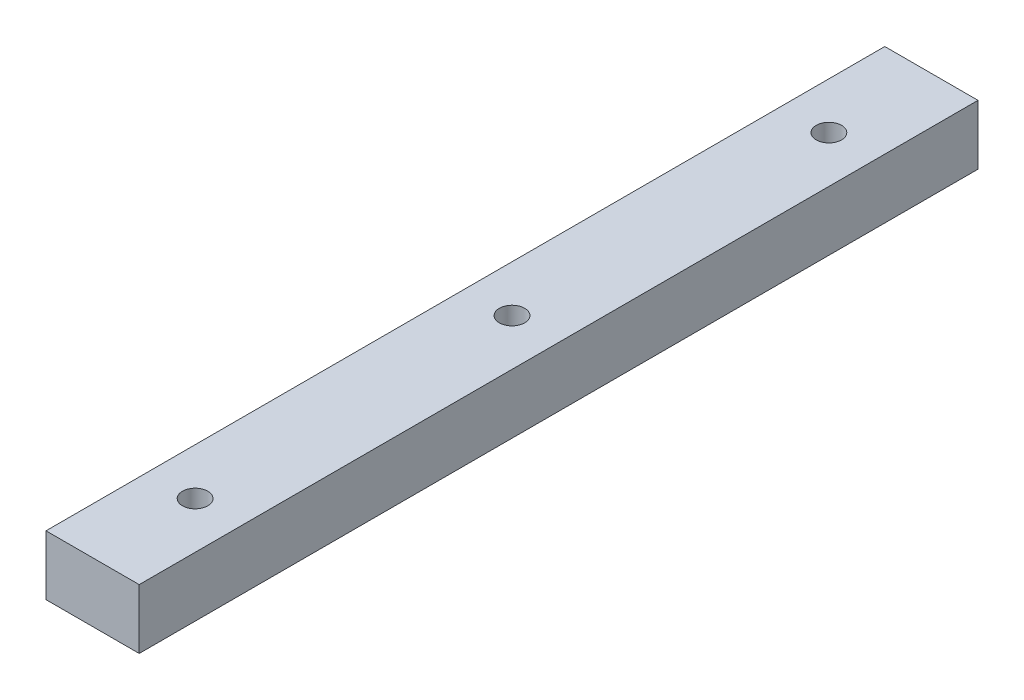
ISO-10303-21;
HEADER;
FILE_DESCRIPTION(('STEP AP214'),'2;1');
FILE_NAME('part.step','',(''),(''),'','','');
FILE_SCHEMA(('AUTOMOTIVE_DESIGN { 1 0 10303 214 1 1 1 1 }'));
ENDSEC;
DATA;
#1=APPLICATION_CONTEXT('core data for automotive mechanical design processes');
#2=APPLICATION_PROTOCOL_DEFINITION('international standard','automotive_design',2000,#1);
#3=PRODUCT_CONTEXT('',#1,'mechanical');
#4=PRODUCT('Part','Part','',(#3));
#5=PRODUCT_RELATED_PRODUCT_CATEGORY('part','',(#4));
#6=PRODUCT_DEFINITION_FORMATION('','',#4);
#7=PRODUCT_DEFINITION_CONTEXT('part definition',#1,'design');
#8=PRODUCT_DEFINITION('design','',#6,#7);
#9=PRODUCT_DEFINITION_SHAPE('','',#8);
#10=(LENGTH_UNIT() NAMED_UNIT(*) SI_UNIT(.MILLI.,.METRE.));
#11=(NAMED_UNIT(*) PLANE_ANGLE_UNIT() SI_UNIT($,.RADIAN.));
#12=(NAMED_UNIT(*) SI_UNIT($,.STERADIAN.) SOLID_ANGLE_UNIT());
#13=UNCERTAINTY_MEASURE_WITH_UNIT(LENGTH_MEASURE(1.E-05),#10,'distance_accuracy_value','');
#14=(GEOMETRIC_REPRESENTATION_CONTEXT(3) GLOBAL_UNCERTAINTY_ASSIGNED_CONTEXT((#13)) GLOBAL_UNIT_ASSIGNED_CONTEXT((#10,
#11,#12)) REPRESENTATION_CONTEXT('',''));
#15=CARTESIAN_POINT('',(0.,0.,0.));
#16=DIRECTION('',(0.,0.,1.));
#17=DIRECTION('',(1.,0.,0.));
#18=AXIS2_PLACEMENT_3D('',#15,#16,#17);
#19=CARTESIAN_POINT('',(12.5,-16.,112.5));
#20=DIRECTION('',(1.,0.,0.));
#21=DIRECTION('',(0.,0.,-1.));
#22=AXIS2_PLACEMENT_3D('',#19,#20,#21);
#23=PLANE('',#22);
#24=DIRECTION('',(0.,0.,-1.));
#25=VECTOR('',#24,1.);
#26=CARTESIAN_POINT('',(12.5,0.,112.5));
#27=LINE('',#26,#25);
#28=CARTESIAN_POINT('',(12.5,0.,112.5));
#29=VERTEX_POINT('',#28);
#30=CARTESIAN_POINT('',(12.5,0.,-112.5));
#31=VERTEX_POINT('',#30);
#32=EDGE_CURVE('E112',#29,#31,#27,.T.);
#33=ORIENTED_EDGE('',*,*,#32,.F.);
#34=DIRECTION('',(0.,1.,0.));
#35=VECTOR('',#34,1.);
#36=CARTESIAN_POINT('',(12.5,-16.,112.5));
#37=LINE('',#36,#35);
#38=CARTESIAN_POINT('',(12.5,-16.,112.5));
#39=VERTEX_POINT('',#38);
#40=EDGE_CURVE('E11',#39,#29,#37,.T.);
#41=ORIENTED_EDGE('',*,*,#40,.F.);
#42=DIRECTION('',(0.,0.,-1.));
#43=VECTOR('',#42,1.);
#44=CARTESIAN_POINT('',(12.5,-16.,112.5));
#45=LINE('',#44,#43);
#46=CARTESIAN_POINT('',(12.5,-16.,-112.5));
#47=VERTEX_POINT('',#46);
#48=EDGE_CURVE('E105',#39,#47,#45,.T.);
#49=ORIENTED_EDGE('',*,*,#48,.T.);
#50=DIRECTION('',(0.,1.,0.));
#51=VECTOR('',#50,1.);
#52=CARTESIAN_POINT('',(12.5,-16.,-112.5));
#53=LINE('',#52,#51);
#54=EDGE_CURVE('E50',#47,#31,#53,.T.);
#55=ORIENTED_EDGE('',*,*,#54,.T.);
#56=EDGE_LOOP('',(#33,#41,#49,#55));
#57=FACE_BOUND('',#56,.T.);
#58=ADVANCED_FACE('F47',(#57),#23,.T.);
#59=CARTESIAN_POINT('',(-12.5,-16.,112.5));
#60=DIRECTION('',(0.,0.,1.));
#61=DIRECTION('',(1.,0.,0.));
#62=AXIS2_PLACEMENT_3D('',#59,#60,#61);
#63=PLANE('',#62);
#64=DIRECTION('',(1.,0.,0.));
#65=VECTOR('',#64,1.);
#66=CARTESIAN_POINT('',(-12.5,0.,112.5));
#67=LINE('',#66,#65);
#68=CARTESIAN_POINT('',(-12.5,0.,112.5));
#69=VERTEX_POINT('',#68);
#70=EDGE_CURVE('E107',#69,#29,#67,.T.);
#71=ORIENTED_EDGE('',*,*,#70,.F.);
#72=DIRECTION('',(0.,1.,0.));
#73=VECTOR('',#72,1.);
#74=CARTESIAN_POINT('',(-12.5,-16.,112.5));
#75=LINE('',#74,#73);
#76=CARTESIAN_POINT('',(-12.5,-16.,112.5));
#77=VERTEX_POINT('',#76);
#78=EDGE_CURVE('E56',#77,#69,#75,.T.);
#79=ORIENTED_EDGE('',*,*,#78,.F.);
#80=DIRECTION('',(1.,0.,0.));
#81=VECTOR('',#80,1.);
#82=CARTESIAN_POINT('',(-12.5,-16.,112.5));
#83=LINE('',#82,#81);
#84=EDGE_CURVE('E102',#77,#39,#83,.T.);
#85=ORIENTED_EDGE('',*,*,#84,.T.);
#86=ORIENTED_EDGE('',*,*,#40,.T.);
#87=EDGE_LOOP('',(#71,#79,#85,#86));
#88=FACE_BOUND('',#87,.T.);
#89=ADVANCED_FACE('F123',(#88),#63,.T.);
#90=CARTESIAN_POINT('',(-12.5,-16.,112.5));
#91=DIRECTION('',(-1.,0.,0.));
#92=DIRECTION('',(0.,0.,1.));
#93=AXIS2_PLACEMENT_3D('',#90,#91,#92);
#94=PLANE('',#93);
#95=DIRECTION('',(0.,0.,1.));
#96=VECTOR('',#95,1.);
#97=CARTESIAN_POINT('',(-12.5,0.,112.5));
#98=LINE('',#97,#96);
#99=CARTESIAN_POINT('',(-12.5,0.,-112.5));
#100=VERTEX_POINT('',#99);
#101=EDGE_CURVE('E97',#100,#69,#98,.T.);
#102=ORIENTED_EDGE('',*,*,#101,.F.);
#103=DIRECTION('',(0.,1.,0.));
#104=VECTOR('',#103,1.);
#105=CARTESIAN_POINT('',(-12.5,-16.,-112.5));
#106=LINE('',#105,#104);
#107=CARTESIAN_POINT('',(-12.5,-16.,-112.5));
#108=VERTEX_POINT('',#107);
#109=EDGE_CURVE('E92',#108,#100,#106,.T.);
#110=ORIENTED_EDGE('',*,*,#109,.F.);
#111=DIRECTION('',(0.,0.,1.));
#112=VECTOR('',#111,1.);
#113=CARTESIAN_POINT('',(-12.5,-16.,112.5));
#114=LINE('',#113,#112);
#115=EDGE_CURVE('E95',#108,#77,#114,.T.);
#116=ORIENTED_EDGE('',*,*,#115,.T.);
#117=ORIENTED_EDGE('',*,*,#78,.T.);
#118=EDGE_LOOP('',(#102,#110,#116,#117));
#119=FACE_BOUND('',#118,.T.);
#120=ADVANCED_FACE('F94',(#119),#94,.T.);
#121=CARTESIAN_POINT('',(-12.5,-16.,-112.5));
#122=DIRECTION('',(0.,0.,-1.));
#123=DIRECTION('',(-1.,0.,0.));
#124=AXIS2_PLACEMENT_3D('',#121,#122,#123);
#125=PLANE('',#124);
#126=DIRECTION('',(-1.,0.,0.));
#127=VECTOR('',#126,1.);
#128=CARTESIAN_POINT('',(-12.5,0.,-112.5));
#129=LINE('',#128,#127);
#130=EDGE_CURVE('E115',#31,#100,#129,.T.);
#131=ORIENTED_EDGE('',*,*,#130,.F.);
#132=ORIENTED_EDGE('',*,*,#54,.F.);
#133=DIRECTION('',(-1.,0.,0.));
#134=VECTOR('',#133,1.);
#135=CARTESIAN_POINT('',(-12.5,-16.,-112.5));
#136=LINE('',#135,#134);
#137=EDGE_CURVE('E101',#47,#108,#136,.T.);
#138=ORIENTED_EDGE('',*,*,#137,.T.);
#139=ORIENTED_EDGE('',*,*,#109,.T.);
#140=EDGE_LOOP('',(#131,#132,#138,#139));
#141=FACE_BOUND('',#140,.T.);
#142=ADVANCED_FACE('F104',(#141),#125,.T.);
#143=CARTESIAN_POINT('',(0.,-16.,0.));
#144=DIRECTION('',(0.,-1.,0.));
#145=DIRECTION('',(0.,0.,-1.));
#146=AXIS2_PLACEMENT_3D('',#143,#144,#145);
#147=PLANE('',#146);
#148=CARTESIAN_POINT('',(0.,-16.,-85.));
#149=DIRECTION('',(0.,1.,0.));
#150=DIRECTION('',(0.,0.,1.));
#151=AXIS2_PLACEMENT_3D('',#148,#149,#150);
#152=CIRCLE('',#151,3.4);
#153=CARTESIAN_POINT('',(0.,-16.,-81.6));
#154=VERTEX_POINT('',#153);
#155=EDGE_CURVE('E177',#154,#154,#152,.T.);
#156=ORIENTED_EDGE('',*,*,#155,.T.);
#157=EDGE_LOOP('',(#156));
#158=FACE_BOUND('',#157,.T.);
#159=CARTESIAN_POINT('',(0.,-16.,0.));
#160=DIRECTION('',(0.,1.,0.));
#161=DIRECTION('',(0.,0.,1.));
#162=AXIS2_PLACEMENT_3D('',#159,#160,#161);
#163=CIRCLE('',#162,3.4);
#164=CARTESIAN_POINT('',(0.,-16.,3.4));
#165=VERTEX_POINT('',#164);
#166=EDGE_CURVE('E187',#165,#165,#163,.T.);
#167=ORIENTED_EDGE('',*,*,#166,.T.);
#168=EDGE_LOOP('',(#167));
#169=FACE_BOUND('',#168,.T.);
#170=CARTESIAN_POINT('',(0.,-16.,85.));
#171=DIRECTION('',(0.,1.,0.));
#172=DIRECTION('',(0.,0.,1.));
#173=AXIS2_PLACEMENT_3D('',#170,#171,#172);
#174=CIRCLE('',#173,3.4);
#175=CARTESIAN_POINT('',(0.,-16.,88.4));
#176=VERTEX_POINT('',#175);
#177=EDGE_CURVE('E193',#176,#176,#174,.T.);
#178=ORIENTED_EDGE('',*,*,#177,.T.);
#179=EDGE_LOOP('',(#178));
#180=FACE_BOUND('',#179,.T.);
#181=CARTESIAN_POINT('',(7.21644966006352E-13,-16.,100.000000000005));
#182=DIRECTION('',(0.,-1.,0.));
#183=DIRECTION('',(0.,0.,-1.));
#184=AXIS2_PLACEMENT_3D('',#181,#182,#183);
#185=CIRCLE('',#184,8.50000000000001);
#186=CARTESIAN_POINT('',(7.21644966006352E-13,-16.,91.5000000000049));
#187=VERTEX_POINT('',#186);
#188=EDGE_CURVE('E199',#187,#187,#185,.T.);
#189=ORIENTED_EDGE('',*,*,#188,.F.);
#190=EDGE_LOOP('',(#189));
#191=FACE_BOUND('',#190,.T.);
#192=CARTESIAN_POINT('',(7.21644966006352E-13,-16.,-100.000000000005));
#193=DIRECTION('',(0.,-1.,0.));
#194=DIRECTION('',(0.,0.,-1.));
#195=AXIS2_PLACEMENT_3D('',#192,#193,#194);
#196=CIRCLE('',#195,8.50000000000001);
#197=CARTESIAN_POINT('',(7.21644966006352E-13,-16.,-108.500000000005));
#198=VERTEX_POINT('',#197);
#199=EDGE_CURVE('E202',#198,#198,#196,.T.);
#200=ORIENTED_EDGE('',*,*,#199,.F.);
#201=EDGE_LOOP('',(#200));
#202=FACE_BOUND('',#201,.T.);
#203=ORIENTED_EDGE('',*,*,#48,.F.);
#204=ORIENTED_EDGE('',*,*,#84,.F.);
#205=ORIENTED_EDGE('',*,*,#115,.F.);
#206=ORIENTED_EDGE('',*,*,#137,.F.);
#207=EDGE_LOOP('',(#203,#204,#205,#206));
#208=FACE_BOUND('',#207,.T.);
#209=ADVANCED_FACE('F100',(#158,#169,#180,#191,#202,#208),#147,.T.);
#210=CARTESIAN_POINT('',(0.,0.,0.));
#211=DIRECTION('',(0.,-1.,0.));
#212=DIRECTION('',(0.,0.,-1.));
#213=AXIS2_PLACEMENT_3D('',#210,#211,#212);
#214=PLANE('',#213);
#215=CARTESIAN_POINT('',(0.,0.,-85.));
#216=DIRECTION('',(0.,1.,0.));
#217=DIRECTION('',(0.,0.,1.));
#218=AXIS2_PLACEMENT_3D('',#215,#216,#217);
#219=CIRCLE('',#218,3.4);
#220=CARTESIAN_POINT('',(0.,0.,-81.6));
#221=VERTEX_POINT('',#220);
#222=EDGE_CURVE('E180',#221,#221,#219,.T.);
#223=ORIENTED_EDGE('',*,*,#222,.F.);
#224=EDGE_LOOP('',(#223));
#225=FACE_BOUND('',#224,.T.);
#226=CARTESIAN_POINT('',(0.,0.,0.));
#227=DIRECTION('',(0.,1.,0.));
#228=DIRECTION('',(0.,0.,1.));
#229=AXIS2_PLACEMENT_3D('',#226,#227,#228);
#230=CIRCLE('',#229,3.4);
#231=CARTESIAN_POINT('',(0.,0.,3.4));
#232=VERTEX_POINT('',#231);
#233=EDGE_CURVE('E182',#232,#232,#230,.T.);
#234=ORIENTED_EDGE('',*,*,#233,.F.);
#235=EDGE_LOOP('',(#234));
#236=FACE_BOUND('',#235,.T.);
#237=CARTESIAN_POINT('',(0.,0.,85.));
#238=DIRECTION('',(0.,1.,0.));
#239=DIRECTION('',(0.,0.,1.));
#240=AXIS2_PLACEMENT_3D('',#237,#238,#239);
#241=CIRCLE('',#240,3.4);
#242=CARTESIAN_POINT('',(0.,0.,88.4));
#243=VERTEX_POINT('',#242);
#244=EDGE_CURVE('E190',#243,#243,#241,.T.);
#245=ORIENTED_EDGE('',*,*,#244,.F.);
#246=EDGE_LOOP('',(#245));
#247=FACE_BOUND('',#246,.T.);
#248=ORIENTED_EDGE('',*,*,#32,.T.);
#249=ORIENTED_EDGE('',*,*,#130,.T.);
#250=ORIENTED_EDGE('',*,*,#101,.T.);
#251=ORIENTED_EDGE('',*,*,#70,.T.);
#252=EDGE_LOOP('',(#248,#249,#250,#251));
#253=FACE_BOUND('',#252,.T.);
#254=ADVANCED_FACE('F122',(#225,#236,#247,#253),#214,.F.);
#255=CARTESIAN_POINT('',(7.21644966006352E-13,-11.,-100.000000000005));
#256=DIRECTION('',(0.,-1.,0.));
#257=DIRECTION('',(0.,0.,-1.));
#258=AXIS2_PLACEMENT_3D('',#255,#256,#257);
#259=CYLINDRICAL_SURFACE('',#258,8.50000000000001);
#260=CARTESIAN_POINT('',(7.21644966006352E-13,-11.,-100.000000000005));
#261=DIRECTION('',(0.,-1.,0.));
#262=DIRECTION('',(0.,0.,-1.));
#263=AXIS2_PLACEMENT_3D('',#260,#261,#262);
#264=CIRCLE('',#263,8.50000000000001);
#265=CARTESIAN_POINT('',(7.21644966006352E-13,-11.,-108.500000000005));
#266=VERTEX_POINT('',#265);
#267=EDGE_CURVE('E196',#266,#266,#264,.T.);
#268=ORIENTED_EDGE('',*,*,#267,.F.);
#269=EDGE_LOOP('',(#268));
#270=FACE_BOUND('',#269,.T.);
#271=ORIENTED_EDGE('',*,*,#199,.T.);
#272=EDGE_LOOP('',(#271));
#273=FACE_BOUND('',#272,.T.);
#274=ADVANCED_FACE('F144',(#270,#273),#259,.F.);
#275=CARTESIAN_POINT('',(7.21644966006352E-13,-11.,-100.000000000005));
#276=DIRECTION('',(0.,-1.,0.));
#277=DIRECTION('',(0.,0.,-1.));
#278=AXIS2_PLACEMENT_3D('',#275,#276,#277);
#279=PLANE('',#278);
#280=ORIENTED_EDGE('',*,*,#267,.T.);
#281=EDGE_LOOP('',(#280));
#282=FACE_BOUND('',#281,.T.);
#283=ADVANCED_FACE('F149',(#282),#279,.T.);
#284=CARTESIAN_POINT('',(7.21644966006352E-13,-11.,100.000000000005));
#285=DIRECTION('',(0.,-1.,0.));
#286=DIRECTION('',(0.,0.,-1.));
#287=AXIS2_PLACEMENT_3D('',#284,#285,#286);
#288=CYLINDRICAL_SURFACE('',#287,8.50000000000001);
#289=CARTESIAN_POINT('',(7.21644966006352E-13,-11.,100.000000000005));
#290=DIRECTION('',(0.,-1.,0.));
#291=DIRECTION('',(0.,0.,-1.));
#292=AXIS2_PLACEMENT_3D('',#289,#290,#291);
#293=CIRCLE('',#292,8.50000000000001);
#294=CARTESIAN_POINT('',(7.21644966006352E-13,-11.,91.5000000000049));
#295=VERTEX_POINT('',#294);
#296=EDGE_CURVE('E116',#295,#295,#293,.T.);
#297=ORIENTED_EDGE('',*,*,#296,.F.);
#298=EDGE_LOOP('',(#297));
#299=FACE_BOUND('',#298,.T.);
#300=ORIENTED_EDGE('',*,*,#188,.T.);
#301=EDGE_LOOP('',(#300));
#302=FACE_BOUND('',#301,.T.);
#303=ADVANCED_FACE('F152',(#299,#302),#288,.F.);
#304=CARTESIAN_POINT('',(7.21644966006352E-13,-11.,100.000000000005));
#305=DIRECTION('',(0.,-1.,0.));
#306=DIRECTION('',(0.,0.,-1.));
#307=AXIS2_PLACEMENT_3D('',#304,#305,#306);
#308=PLANE('',#307);
#309=ORIENTED_EDGE('',*,*,#296,.T.);
#310=EDGE_LOOP('',(#309));
#311=FACE_BOUND('',#310,.T.);
#312=ADVANCED_FACE('F158',(#311),#308,.T.);
#313=CARTESIAN_POINT('',(0.,0.,85.));
#314=DIRECTION('',(0.,1.,0.));
#315=DIRECTION('',(0.,0.,1.));
#316=AXIS2_PLACEMENT_3D('',#313,#314,#315);
#317=CYLINDRICAL_SURFACE('',#316,3.4);
#318=ORIENTED_EDGE('',*,*,#177,.F.);
#319=EDGE_LOOP('',(#318));
#320=FACE_BOUND('',#319,.T.);
#321=ORIENTED_EDGE('',*,*,#244,.T.);
#322=EDGE_LOOP('',(#321));
#323=FACE_BOUND('',#322,.T.);
#324=ADVANCED_FACE('F161',(#320,#323),#317,.F.);
#325=CARTESIAN_POINT('',(0.,0.,0.));
#326=DIRECTION('',(0.,1.,0.));
#327=DIRECTION('',(0.,0.,1.));
#328=AXIS2_PLACEMENT_3D('',#325,#326,#327);
#329=CYLINDRICAL_SURFACE('',#328,3.4);
#330=ORIENTED_EDGE('',*,*,#166,.F.);
#331=EDGE_LOOP('',(#330));
#332=FACE_BOUND('',#331,.T.);
#333=ORIENTED_EDGE('',*,*,#233,.T.);
#334=EDGE_LOOP('',(#333));
#335=FACE_BOUND('',#334,.T.);
#336=ADVANCED_FACE('F165',(#332,#335),#329,.F.);
#337=CARTESIAN_POINT('',(0.,0.,-85.));
#338=DIRECTION('',(0.,1.,0.));
#339=DIRECTION('',(0.,0.,1.));
#340=AXIS2_PLACEMENT_3D('',#337,#338,#339);
#341=CYLINDRICAL_SURFACE('',#340,3.4);
#342=ORIENTED_EDGE('',*,*,#155,.F.);
#343=EDGE_LOOP('',(#342));
#344=FACE_BOUND('',#343,.T.);
#345=ORIENTED_EDGE('',*,*,#222,.T.);
#346=EDGE_LOOP('',(#345));
#347=FACE_BOUND('',#346,.T.);
#348=ADVANCED_FACE('F169',(#344,#347),#341,.F.);
#349=CLOSED_SHELL('',(#58,#89,#120,#142,#209,#254,#274,#283,#303,#312,#324,#336,#348));
#350=MANIFOLD_SOLID_BREP('B2',#349);
#351=ADVANCED_BREP_SHAPE_REPRESENTATION('',(#18,#350),#14);
#352=SHAPE_DEFINITION_REPRESENTATION(#9,#351);
ENDSEC;
END-ISO-10303-21;
